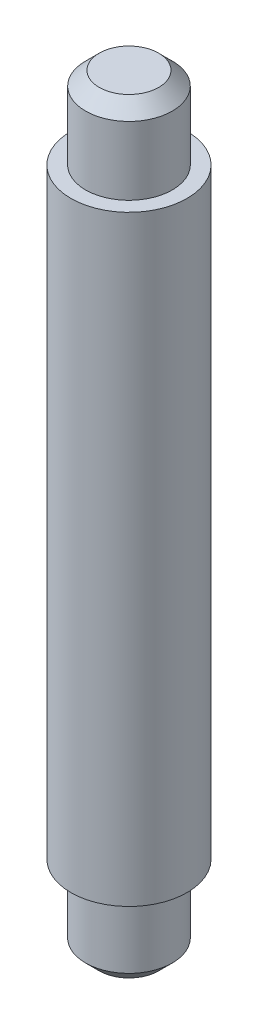
ISO-10303-21;
HEADER;
FILE_DESCRIPTION(('STEP AP214'),'2;1');
FILE_NAME('part.step','',(''),(''),'','','');
FILE_SCHEMA(('AUTOMOTIVE_DESIGN { 1 0 10303 214 1 1 1 1 }'));
ENDSEC;
DATA;
#1=APPLICATION_CONTEXT('core data for automotive mechanical design processes');
#2=APPLICATION_PROTOCOL_DEFINITION('international standard','automotive_design',2000,#1);
#3=PRODUCT_CONTEXT('',#1,'mechanical');
#4=PRODUCT('Part','Part','',(#3));
#5=PRODUCT_RELATED_PRODUCT_CATEGORY('part','',(#4));
#6=PRODUCT_DEFINITION_FORMATION('','',#4);
#7=PRODUCT_DEFINITION_CONTEXT('part definition',#1,'design');
#8=PRODUCT_DEFINITION('design','',#6,#7);
#9=PRODUCT_DEFINITION_SHAPE('','',#8);
#10=(LENGTH_UNIT() NAMED_UNIT(*) SI_UNIT(.MILLI.,.METRE.));
#11=(NAMED_UNIT(*) PLANE_ANGLE_UNIT() SI_UNIT($,.RADIAN.));
#12=(NAMED_UNIT(*) SI_UNIT($,.STERADIAN.) SOLID_ANGLE_UNIT());
#13=UNCERTAINTY_MEASURE_WITH_UNIT(LENGTH_MEASURE(1.E-05),#10,'distance_accuracy_value','');
#14=(GEOMETRIC_REPRESENTATION_CONTEXT(3) GLOBAL_UNCERTAINTY_ASSIGNED_CONTEXT((#13)) GLOBAL_UNIT_ASSIGNED_CONTEXT((#10,
#11,#12)) REPRESENTATION_CONTEXT('',''));
#15=CARTESIAN_POINT('',(0.,0.,0.));
#16=DIRECTION('',(0.,0.,1.));
#17=DIRECTION('',(1.,0.,0.));
#18=AXIS2_PLACEMENT_3D('',#15,#16,#17);
#19=CARTESIAN_POINT('',(0.,56.,0.));
#20=DIRECTION('',(0.,-1.,0.));
#21=DIRECTION('',(0.,0.,-1.));
#22=AXIS2_PLACEMENT_3D('',#19,#20,#21);
#23=CYLINDRICAL_SURFACE('',#22,3.175);
#24=CARTESIAN_POINT('',(0.,55.,0.));
#25=DIRECTION('',(0.,1.,0.));
#26=DIRECTION('',(0.,0.,1.));
#27=AXIS2_PLACEMENT_3D('',#24,#25,#26);
#28=CIRCLE('',#27,3.175);
#29=CARTESIAN_POINT('',(0.,55.,3.175));
#30=VERTEX_POINT('',#29);
#31=EDGE_CURVE('E10',#30,#30,#28,.F.);
#32=ORIENTED_EDGE('',*,*,#31,.T.);
#33=EDGE_LOOP('',(#32));
#34=FACE_BOUND('',#33,.T.);
#35=CARTESIAN_POINT('',(0.,50.,0.));
#36=DIRECTION('',(0.,1.,0.));
#37=DIRECTION('',(0.,0.,1.));
#38=AXIS2_PLACEMENT_3D('',#35,#36,#37);
#39=CIRCLE('',#38,3.175);
#40=CARTESIAN_POINT('',(0.,50.,3.175));
#41=VERTEX_POINT('',#40);
#42=EDGE_CURVE('E75',#41,#41,#39,.T.);
#43=ORIENTED_EDGE('',*,*,#42,.T.);
#44=EDGE_LOOP('',(#43));
#45=FACE_BOUND('',#44,.T.);
#46=ADVANCED_FACE('F41',(#34,#45),#23,.T.);
#47=CARTESIAN_POINT('',(0.,56.,0.));
#48=DIRECTION('',(0.,1.,0.));
#49=DIRECTION('',(0.,0.,1.));
#50=AXIS2_PLACEMENT_3D('',#47,#48,#49);
#51=PLANE('',#50);
#52=CARTESIAN_POINT('',(0.,56.,0.));
#53=DIRECTION('',(0.,1.,0.));
#54=DIRECTION('',(0.,0.,1.));
#55=AXIS2_PLACEMENT_3D('',#52,#53,#54);
#56=CIRCLE('',#55,2.17500000000001);
#57=CARTESIAN_POINT('',(0.,56.,2.17500000000001));
#58=VERTEX_POINT('',#57);
#59=EDGE_CURVE('E50',#58,#58,#56,.T.);
#60=ORIENTED_EDGE('',*,*,#59,.T.);
#61=EDGE_LOOP('',(#60));
#62=FACE_BOUND('',#61,.T.);
#63=ADVANCED_FACE('F87',(#62),#51,.T.);
#64=CARTESIAN_POINT('',(0.,50.,0.));
#65=DIRECTION('',(0.,1.,0.));
#66=DIRECTION('',(0.,0.,1.));
#67=AXIS2_PLACEMENT_3D('',#64,#65,#66);
#68=PLANE('',#67);
#69=CARTESIAN_POINT('',(0.,50.,0.));
#70=DIRECTION('',(0.,1.,0.));
#71=DIRECTION('',(0.,0.,1.));
#72=AXIS2_PLACEMENT_3D('',#69,#70,#71);
#73=CIRCLE('',#72,4.25);
#74=CARTESIAN_POINT('',(0.,50.,4.25));
#75=VERTEX_POINT('',#74);
#76=EDGE_CURVE('E70',#75,#75,#73,.T.);
#77=ORIENTED_EDGE('',*,*,#76,.T.);
#78=EDGE_LOOP('',(#77));
#79=FACE_BOUND('',#78,.T.);
#80=ORIENTED_EDGE('',*,*,#42,.F.);
#81=EDGE_LOOP('',(#80));
#82=FACE_BOUND('',#81,.T.);
#83=ADVANCED_FACE('F84',(#79,#82),#68,.T.);
#84=CARTESIAN_POINT('',(0.,6.,0.));
#85=DIRECTION('',(0.,1.,0.));
#86=DIRECTION('',(0.,0.,1.));
#87=AXIS2_PLACEMENT_3D('',#84,#85,#86);
#88=PLANE('',#87);
#89=CARTESIAN_POINT('',(0.,6.,0.));
#90=DIRECTION('',(0.,1.,0.));
#91=DIRECTION('',(0.,0.,1.));
#92=AXIS2_PLACEMENT_3D('',#89,#90,#91);
#93=CIRCLE('',#92,4.25);
#94=CARTESIAN_POINT('',(0.,6.,4.25));
#95=VERTEX_POINT('',#94);
#96=EDGE_CURVE('E71',#95,#95,#93,.T.);
#97=ORIENTED_EDGE('',*,*,#96,.F.);
#98=EDGE_LOOP('',(#97));
#99=FACE_BOUND('',#98,.T.);
#100=CARTESIAN_POINT('',(0.,6.,0.));
#101=DIRECTION('',(0.,1.,0.));
#102=DIRECTION('',(0.,0.,1.));
#103=AXIS2_PLACEMENT_3D('',#100,#101,#102);
#104=CIRCLE('',#103,3.175);
#105=CARTESIAN_POINT('',(0.,6.,3.175));
#106=VERTEX_POINT('',#105);
#107=EDGE_CURVE('E66',#106,#106,#104,.T.);
#108=ORIENTED_EDGE('',*,*,#107,.T.);
#109=EDGE_LOOP('',(#108));
#110=FACE_BOUND('',#109,.T.);
#111=ADVANCED_FACE('F86',(#99,#110),#88,.F.);
#112=CARTESIAN_POINT('',(0.,50.,0.));
#113=DIRECTION('',(0.,-1.,0.));
#114=DIRECTION('',(0.,0.,-1.));
#115=AXIS2_PLACEMENT_3D('',#112,#113,#114);
#116=CYLINDRICAL_SURFACE('',#115,4.25);
#117=ORIENTED_EDGE('',*,*,#76,.F.);
#118=EDGE_LOOP('',(#117));
#119=FACE_BOUND('',#118,.T.);
#120=ORIENTED_EDGE('',*,*,#96,.T.);
#121=EDGE_LOOP('',(#120));
#122=FACE_BOUND('',#121,.T.);
#123=ADVANCED_FACE('F94',(#119,#122),#116,.T.);
#124=CARTESIAN_POINT('',(0.,0.,0.));
#125=DIRECTION('',(0.,1.,0.));
#126=DIRECTION('',(0.,0.,1.));
#127=AXIS2_PLACEMENT_3D('',#124,#125,#126);
#128=PLANE('',#127);
#129=CARTESIAN_POINT('',(0.,0.,0.));
#130=DIRECTION('',(0.,1.,0.));
#131=DIRECTION('',(0.,0.,1.));
#132=AXIS2_PLACEMENT_3D('',#129,#130,#131);
#133=CIRCLE('',#132,2.17499999999999);
#134=CARTESIAN_POINT('',(0.,0.,2.17499999999999));
#135=VERTEX_POINT('',#134);
#136=EDGE_CURVE('E55',#135,#135,#133,.F.);
#137=ORIENTED_EDGE('',*,*,#136,.T.);
#138=EDGE_LOOP('',(#137));
#139=FACE_BOUND('',#138,.T.);
#140=ADVANCED_FACE('F106',(#139),#128,.F.);
#141=CARTESIAN_POINT('',(0.,1.00000000000001,0.));
#142=DIRECTION('',(0.,1.,0.));
#143=DIRECTION('',(0.,0.,1.));
#144=AXIS2_PLACEMENT_3D('',#141,#142,#143);
#145=CIRCLE('',#144,3.175);
#146=CARTESIAN_POINT('',(0.,1.00000000000001,3.175));
#147=VERTEX_POINT('',#146);
#148=EDGE_CURVE('E60',#147,#147,#145,.T.);
#149=ORIENTED_EDGE('',*,*,#148,.T.);
#150=EDGE_LOOP('',(#149));
#151=FACE_BOUND('',#150,.T.);
#152=ORIENTED_EDGE('',*,*,#107,.F.);
#153=EDGE_LOOP('',(#152));
#154=FACE_BOUND('',#153,.T.);
#155=ADVANCED_FACE('F100',(#151,#154),#23,.T.);
#156=CARTESIAN_POINT('',(0.,1.00000000000001,0.));
#157=DIRECTION('',(0.,1.,0.));
#158=DIRECTION('',(0.,0.,1.));
#159=AXIS2_PLACEMENT_3D('',#156,#157,#158);
#160=CONICAL_SURFACE('',#159,3.175,0.785398163397449);
#161=ORIENTED_EDGE('',*,*,#136,.F.);
#162=EDGE_LOOP('',(#161));
#163=FACE_BOUND('',#162,.T.);
#164=ORIENTED_EDGE('',*,*,#148,.F.);
#165=EDGE_LOOP('',(#164));
#166=FACE_BOUND('',#165,.T.);
#167=ADVANCED_FACE('F105',(#163,#166),#160,.T.);
#168=CARTESIAN_POINT('',(0.,56.,0.));
#169=DIRECTION('',(0.,-1.,0.));
#170=DIRECTION('',(0.,0.,-1.));
#171=AXIS2_PLACEMENT_3D('',#168,#169,#170);
#172=CONICAL_SURFACE('',#171,2.17500000000001,0.785398163397446);
#173=ORIENTED_EDGE('',*,*,#31,.F.);
#174=EDGE_LOOP('',(#173));
#175=FACE_BOUND('',#174,.T.);
#176=ORIENTED_EDGE('',*,*,#59,.F.);
#177=EDGE_LOOP('',(#176));
#178=FACE_BOUND('',#177,.T.);
#179=ADVANCED_FACE('F44',(#175,#178),#172,.T.);
#180=CLOSED_SHELL('',(#46,#63,#83,#111,#123,#140,#155,#167,#179));
#181=MANIFOLD_SOLID_BREP('B2',#180);
#182=ADVANCED_BREP_SHAPE_REPRESENTATION('',(#18,#181),#14);
#183=SHAPE_DEFINITION_REPRESENTATION(#9,#182);
ENDSEC;
END-ISO-10303-21;
